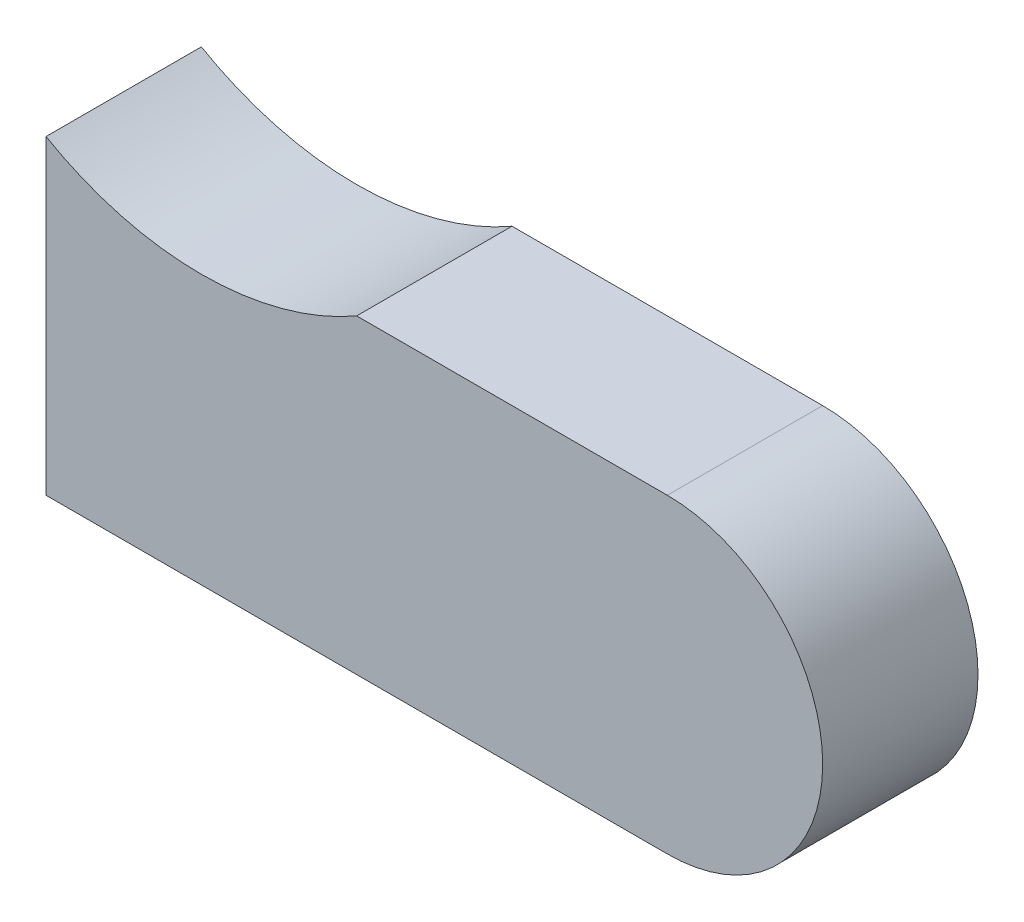
ISO-10303-21;
HEADER;
FILE_DESCRIPTION(('STEP AP214'),'2;1');
FILE_NAME('part.step','',(''),(''),'','','');
FILE_SCHEMA(('AUTOMOTIVE_DESIGN { 1 0 10303 214 1 1 1 1 }'));
ENDSEC;
DATA;
#1=APPLICATION_CONTEXT('core data for automotive mechanical design processes');
#2=APPLICATION_PROTOCOL_DEFINITION('international standard','automotive_design',2000,#1);
#3=PRODUCT_CONTEXT('',#1,'mechanical');
#4=PRODUCT('Part','Part','',(#3));
#5=PRODUCT_RELATED_PRODUCT_CATEGORY('part','',(#4));
#6=PRODUCT_DEFINITION_FORMATION('','',#4);
#7=PRODUCT_DEFINITION_CONTEXT('part definition',#1,'design');
#8=PRODUCT_DEFINITION('design','',#6,#7);
#9=PRODUCT_DEFINITION_SHAPE('','',#8);
#10=(LENGTH_UNIT() NAMED_UNIT(*) SI_UNIT(.MILLI.,.METRE.));
#11=(NAMED_UNIT(*) PLANE_ANGLE_UNIT() SI_UNIT($,.RADIAN.));
#12=(NAMED_UNIT(*) SI_UNIT($,.STERADIAN.) SOLID_ANGLE_UNIT());
#13=UNCERTAINTY_MEASURE_WITH_UNIT(LENGTH_MEASURE(1.E-05),#10,'distance_accuracy_value','');
#14=(GEOMETRIC_REPRESENTATION_CONTEXT(3) GLOBAL_UNCERTAINTY_ASSIGNED_CONTEXT((#13)) GLOBAL_UNIT_ASSIGNED_CONTEXT((#10,
#11,#12)) REPRESENTATION_CONTEXT('',''));
#15=CARTESIAN_POINT('',(0.,0.,0.));
#16=DIRECTION('',(0.,0.,1.));
#17=DIRECTION('',(1.,0.,0.));
#18=AXIS2_PLACEMENT_3D('',#15,#16,#17);
#19=CARTESIAN_POINT('',(0.,10.,5.));
#20=DIRECTION('',(1.,0.,0.));
#21=DIRECTION('',(0.,0.,-1.));
#22=AXIS2_PLACEMENT_3D('',#19,#20,#21);
#23=PLANE('',#22);
#24=DIRECTION('',(0.,-1.,0.));
#25=VECTOR('',#24,1.);
#26=CARTESIAN_POINT('',(0.,10.,0.));
#27=LINE('',#26,#25);
#28=CARTESIAN_POINT('',(0.,10.,0.));
#29=VERTEX_POINT('',#28);
#30=CARTESIAN_POINT('',(0.,0.,0.));
#31=VERTEX_POINT('',#30);
#32=EDGE_CURVE('E107',#29,#31,#27,.T.);
#33=ORIENTED_EDGE('',*,*,#32,.T.);
#34=DIRECTION('',(0.,0.,-1.));
#35=VECTOR('',#34,1.);
#36=CARTESIAN_POINT('',(0.,0.,5.));
#37=LINE('',#36,#35);
#38=CARTESIAN_POINT('',(0.,0.,5.));
#39=VERTEX_POINT('',#38);
#40=EDGE_CURVE('E11',#39,#31,#37,.T.);
#41=ORIENTED_EDGE('',*,*,#40,.F.);
#42=DIRECTION('',(0.,-1.,0.));
#43=VECTOR('',#42,1.);
#44=CARTESIAN_POINT('',(0.,10.,5.));
#45=LINE('',#44,#43);
#46=CARTESIAN_POINT('',(0.,10.,5.));
#47=VERTEX_POINT('',#46);
#48=EDGE_CURVE('E115',#47,#39,#45,.T.);
#49=ORIENTED_EDGE('',*,*,#48,.F.);
#50=DIRECTION('',(0.,0.,-1.));
#51=VECTOR('',#50,1.);
#52=CARTESIAN_POINT('',(0.,10.,5.));
#53=LINE('',#52,#51);
#54=EDGE_CURVE('E103',#47,#29,#53,.T.);
#55=ORIENTED_EDGE('',*,*,#54,.T.);
#56=EDGE_LOOP('',(#33,#41,#49,#55));
#57=FACE_BOUND('',#56,.T.);
#58=ADVANCED_FACE('F33',(#57),#23,.F.);
#59=CARTESIAN_POINT('',(0.,0.,5.));
#60=DIRECTION('',(0.,1.,0.));
#61=DIRECTION('',(0.,0.,1.));
#62=AXIS2_PLACEMENT_3D('',#59,#60,#61);
#63=PLANE('',#62);
#64=DIRECTION('',(1.,0.,0.));
#65=VECTOR('',#64,1.);
#66=CARTESIAN_POINT('',(0.,0.,0.));
#67=LINE('',#66,#65);
#68=CARTESIAN_POINT('',(20.,0.,0.));
#69=VERTEX_POINT('',#68);
#70=EDGE_CURVE('E110',#31,#69,#67,.T.);
#71=ORIENTED_EDGE('',*,*,#70,.T.);
#72=DIRECTION('',(0.,0.,-1.));
#73=VECTOR('',#72,1.);
#74=CARTESIAN_POINT('',(20.,0.,5.));
#75=LINE('',#74,#73);
#76=CARTESIAN_POINT('',(20.,0.,5.));
#77=VERTEX_POINT('',#76);
#78=EDGE_CURVE('E41',#77,#69,#75,.T.);
#79=ORIENTED_EDGE('',*,*,#78,.F.);
#80=DIRECTION('',(1.,0.,0.));
#81=VECTOR('',#80,1.);
#82=CARTESIAN_POINT('',(0.,0.,5.));
#83=LINE('',#82,#81);
#84=EDGE_CURVE('E83',#39,#77,#83,.T.);
#85=ORIENTED_EDGE('',*,*,#84,.F.);
#86=ORIENTED_EDGE('',*,*,#40,.T.);
#87=EDGE_LOOP('',(#71,#79,#85,#86));
#88=FACE_BOUND('',#87,.T.);
#89=ADVANCED_FACE('F134',(#88),#63,.F.);
#90=CARTESIAN_POINT('',(20.,5.,5.));
#91=DIRECTION('',(0.,0.,-1.));
#92=DIRECTION('',(-1.,0.,0.));
#93=AXIS2_PLACEMENT_3D('',#90,#91,#92);
#94=CYLINDRICAL_SURFACE('',#93,5.);
#95=CARTESIAN_POINT('',(20.,5.,0.));
#96=DIRECTION('',(0.,0.,1.));
#97=DIRECTION('',(1.,0.,0.));
#98=AXIS2_PLACEMENT_3D('',#95,#96,#97);
#99=CIRCLE('',#98,5.);
#100=CARTESIAN_POINT('',(20.,10.,0.));
#101=VERTEX_POINT('',#100);
#102=EDGE_CURVE('E98',#69,#101,#99,.T.);
#103=ORIENTED_EDGE('',*,*,#102,.T.);
#104=DIRECTION('',(0.,0.,-1.));
#105=VECTOR('',#104,1.);
#106=CARTESIAN_POINT('',(20.,10.,5.));
#107=LINE('',#106,#105);
#108=CARTESIAN_POINT('',(20.,10.,5.));
#109=VERTEX_POINT('',#108);
#110=EDGE_CURVE('E95',#109,#101,#107,.T.);
#111=ORIENTED_EDGE('',*,*,#110,.F.);
#112=CARTESIAN_POINT('',(20.,5.,5.));
#113=DIRECTION('',(0.,0.,1.));
#114=DIRECTION('',(1.,0.,0.));
#115=AXIS2_PLACEMENT_3D('',#112,#113,#114);
#116=CIRCLE('',#115,5.);
#117=EDGE_CURVE('E87',#77,#109,#116,.T.);
#118=ORIENTED_EDGE('',*,*,#117,.F.);
#119=ORIENTED_EDGE('',*,*,#78,.T.);
#120=EDGE_LOOP('',(#103,#111,#118,#119));
#121=FACE_BOUND('',#120,.T.);
#122=ADVANCED_FACE('F96',(#121),#94,.T.);
#123=CARTESIAN_POINT('',(20.,10.,5.));
#124=DIRECTION('',(0.,-1.,0.));
#125=DIRECTION('',(0.,0.,-1.));
#126=AXIS2_PLACEMENT_3D('',#123,#124,#125);
#127=PLANE('',#126);
#128=DIRECTION('',(-1.,0.,0.));
#129=VECTOR('',#128,1.);
#130=CARTESIAN_POINT('',(20.,10.,0.));
#131=LINE('',#130,#129);
#132=CARTESIAN_POINT('',(10.,10.,0.));
#133=VERTEX_POINT('',#132);
#134=EDGE_CURVE('E69',#101,#133,#131,.T.);
#135=ORIENTED_EDGE('',*,*,#134,.T.);
#136=DIRECTION('',(0.,0.,-1.));
#137=VECTOR('',#136,1.);
#138=CARTESIAN_POINT('',(10.,10.,5.));
#139=LINE('',#138,#137);
#140=CARTESIAN_POINT('',(10.,10.,5.));
#141=VERTEX_POINT('',#140);
#142=EDGE_CURVE('E99',#141,#133,#139,.T.);
#143=ORIENTED_EDGE('',*,*,#142,.F.);
#144=DIRECTION('',(-1.,0.,0.));
#145=VECTOR('',#144,1.);
#146=CARTESIAN_POINT('',(20.,10.,5.));
#147=LINE('',#146,#145);
#148=EDGE_CURVE('E91',#109,#141,#147,.T.);
#149=ORIENTED_EDGE('',*,*,#148,.F.);
#150=ORIENTED_EDGE('',*,*,#110,.T.);
#151=EDGE_LOOP('',(#135,#143,#149,#150));
#152=FACE_BOUND('',#151,.T.);
#153=ADVANCED_FACE('F101',(#152),#127,.F.);
#154=CARTESIAN_POINT('',(5.,18.6602540378444,5.));
#155=DIRECTION('',(0.,0.,-1.));
#156=DIRECTION('',(-1.,0.,0.));
#157=AXIS2_PLACEMENT_3D('',#154,#155,#156);
#158=CYLINDRICAL_SURFACE('',#157,10.);
#159=CARTESIAN_POINT('',(5.,18.6602540378444,0.));
#160=DIRECTION('',(0.,0.,-1.));
#161=DIRECTION('',(-1.,0.,0.));
#162=AXIS2_PLACEMENT_3D('',#159,#160,#161);
#163=CIRCLE('',#162,10.);
#164=EDGE_CURVE('E75',#133,#29,#163,.T.);
#165=ORIENTED_EDGE('',*,*,#164,.T.);
#166=ORIENTED_EDGE('',*,*,#54,.F.);
#167=CARTESIAN_POINT('',(5.,18.6602540378444,5.));
#168=DIRECTION('',(0.,0.,-1.));
#169=DIRECTION('',(-1.,0.,0.));
#170=AXIS2_PLACEMENT_3D('',#167,#168,#169);
#171=CIRCLE('',#170,10.);
#172=EDGE_CURVE('E49',#141,#47,#171,.T.);
#173=ORIENTED_EDGE('',*,*,#172,.F.);
#174=ORIENTED_EDGE('',*,*,#142,.T.);
#175=EDGE_LOOP('',(#165,#166,#173,#174));
#176=FACE_BOUND('',#175,.T.);
#177=ADVANCED_FACE('F123',(#176),#158,.F.);
#178=CARTESIAN_POINT('',(20.,5.,5.));
#179=DIRECTION('',(0.,0.,1.));
#180=DIRECTION('',(1.,0.,0.));
#181=AXIS2_PLACEMENT_3D('',#178,#179,#180);
#182=PLANE('',#181);
#183=ORIENTED_EDGE('',*,*,#48,.T.);
#184=ORIENTED_EDGE('',*,*,#84,.T.);
#185=ORIENTED_EDGE('',*,*,#117,.T.);
#186=ORIENTED_EDGE('',*,*,#148,.T.);
#187=ORIENTED_EDGE('',*,*,#172,.T.);
#188=EDGE_LOOP('',(#183,#184,#185,#186,#187));
#189=FACE_BOUND('',#188,.T.);
#190=ADVANCED_FACE('F89',(#189),#182,.T.);
#191=CARTESIAN_POINT('',(20.,5.,0.));
#192=DIRECTION('',(0.,0.,1.));
#193=DIRECTION('',(1.,0.,0.));
#194=AXIS2_PLACEMENT_3D('',#191,#192,#193);
#195=PLANE('',#194);
#196=ORIENTED_EDGE('',*,*,#32,.F.);
#197=ORIENTED_EDGE('',*,*,#164,.F.);
#198=ORIENTED_EDGE('',*,*,#134,.F.);
#199=ORIENTED_EDGE('',*,*,#102,.F.);
#200=ORIENTED_EDGE('',*,*,#70,.F.);
#201=EDGE_LOOP('',(#196,#197,#198,#199,#200));
#202=FACE_BOUND('',#201,.T.);
#203=ADVANCED_FACE('F119',(#202),#195,.F.);
#204=CLOSED_SHELL('',(#58,#89,#122,#153,#177,#190,#203));
#205=MANIFOLD_SOLID_BREP('B2',#204);
#206=ADVANCED_BREP_SHAPE_REPRESENTATION('',(#18,#205),#14);
#207=SHAPE_DEFINITION_REPRESENTATION(#9,#206);
ENDSEC;
END-ISO-10303-21;
